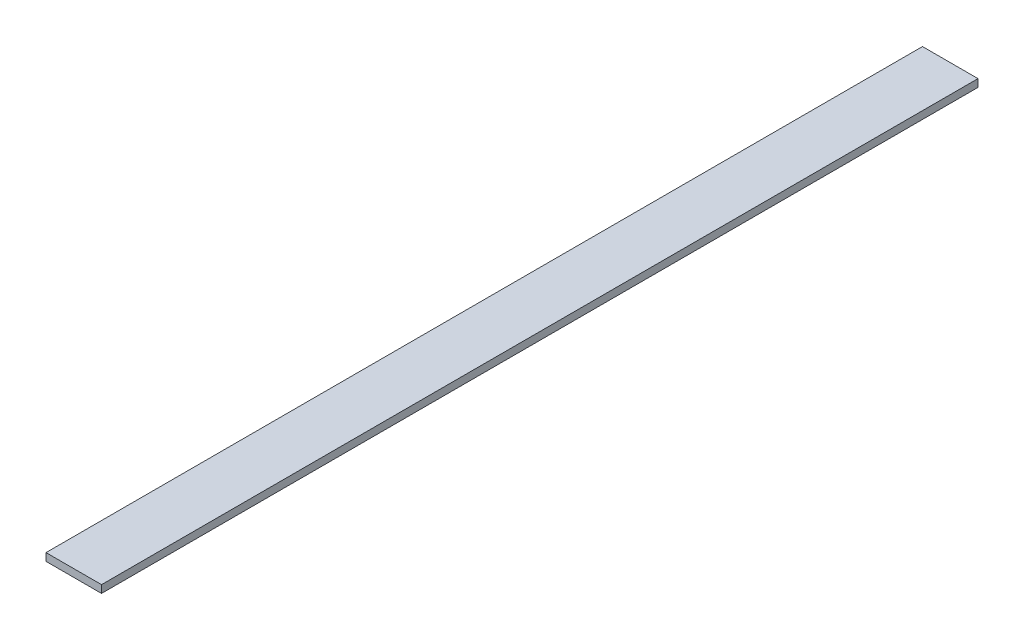
ISO-10303-21;
HEADER;
FILE_DESCRIPTION(('STEP AP214'),'2;1');
FILE_NAME('part.step','',(''),(''),'','','');
FILE_SCHEMA(('AUTOMOTIVE_DESIGN { 1 0 10303 214 1 1 1 1 }'));
ENDSEC;
DATA;
#1=APPLICATION_CONTEXT('core data for automotive mechanical design processes');
#2=APPLICATION_PROTOCOL_DEFINITION('international standard','automotive_design',2000,#1);
#3=PRODUCT_CONTEXT('',#1,'mechanical');
#4=PRODUCT('Part','Part','',(#3));
#5=PRODUCT_RELATED_PRODUCT_CATEGORY('part','',(#4));
#6=PRODUCT_DEFINITION_FORMATION('','',#4);
#7=PRODUCT_DEFINITION_CONTEXT('part definition',#1,'design');
#8=PRODUCT_DEFINITION('design','',#6,#7);
#9=PRODUCT_DEFINITION_SHAPE('','',#8);
#10=(LENGTH_UNIT() NAMED_UNIT(*) SI_UNIT(.MILLI.,.METRE.));
#11=(NAMED_UNIT(*) PLANE_ANGLE_UNIT() SI_UNIT($,.RADIAN.));
#12=(NAMED_UNIT(*) SI_UNIT($,.STERADIAN.) SOLID_ANGLE_UNIT());
#13=UNCERTAINTY_MEASURE_WITH_UNIT(LENGTH_MEASURE(1.E-05),#10,'distance_accuracy_value','');
#14=(GEOMETRIC_REPRESENTATION_CONTEXT(3) GLOBAL_UNCERTAINTY_ASSIGNED_CONTEXT((#13)) GLOBAL_UNIT_ASSIGNED_CONTEXT((#10,
#11,#12)) REPRESENTATION_CONTEXT('',''));
#15=CARTESIAN_POINT('',(0.,0.,0.));
#16=DIRECTION('',(0.,0.,1.));
#17=DIRECTION('',(1.,0.,0.));
#18=AXIS2_PLACEMENT_3D('',#15,#16,#17);
#19=CARTESIAN_POINT('',(-9.07227673497025,-34.3699379173652,21.1841612588325));
#20=DIRECTION('',(0.,-1.,0.));
#21=DIRECTION('',(0.,0.,-1.));
#22=AXIS2_PLACEMENT_3D('',#19,#20,#21);
#23=PLANE('',#22);
#24=DIRECTION('',(0.,0.,1.));
#25=VECTOR('',#24,1.);
#26=CARTESIAN_POINT('',(-8.1449767349703,-34.3699379173652,4.1330362588325));
#27=LINE('',#26,#25);
#28=CARTESIAN_POINT('',(-8.1449767349703,-34.3699379173652,6.2864612588325));
#29=VERTEX_POINT('',#28);
#30=CARTESIAN_POINT('',(-8.1449767349703,-34.3699379173652,8.5818612588325));
#31=VERTEX_POINT('',#30);
#32=EDGE_CURVE('E11',#29,#31,#27,.T.);
#33=ORIENTED_EDGE('',*,*,#32,.T.);
#34=DIRECTION('',(1.,0.,0.));
#35=VECTOR('',#34,1.);
#36=CARTESIAN_POINT('',(25.7516232650298,-34.3699379173652,8.58186125883252));
#37=LINE('',#36,#35);
#38=CARTESIAN_POINT('',(-7.99957673497019,-34.3699379173652,8.5818612588325));
#39=VERTEX_POINT('',#38);
#40=EDGE_CURVE('E99',#31,#39,#37,.T.);
#41=ORIENTED_EDGE('',*,*,#40,.T.);
#42=DIRECTION('',(0.,0.,-1.));
#43=VECTOR('',#42,1.);
#44=CARTESIAN_POINT('',(-7.99957673497019,-34.3699379173652,2.9853362588325));
#45=LINE('',#44,#43);
#46=CARTESIAN_POINT('',(-7.99957673497019,-34.3699379173652,6.2864612588325));
#47=VERTEX_POINT('',#46);
#48=EDGE_CURVE('E75',#39,#47,#45,.T.);
#49=ORIENTED_EDGE('',*,*,#48,.T.);
#50=DIRECTION('',(-1.,0.,0.));
#51=VECTOR('',#50,1.);
#52=CARTESIAN_POINT('',(25.6789232650299,-34.3699379173652,6.28646125883252));
#53=LINE('',#52,#51);
#54=EDGE_CURVE('E83',#47,#29,#53,.T.);
#55=ORIENTED_EDGE('',*,*,#54,.T.);
#56=EDGE_LOOP('',(#33,#41,#49,#55));
#57=FACE_BOUND('',#56,.T.);
#58=ADVANCED_FACE('F16',(#57),#23,.F.);
#59=CARTESIAN_POINT('',(-8.1449767349703,-34.3699379173652,8.5818612588325));
#60=DIRECTION('',(-1.,0.,0.));
#61=DIRECTION('',(0.,1.,0.));
#62=AXIS2_PLACEMENT_3D('',#59,#60,#61);
#63=PLANE('',#62);
#64=ORIENTED_EDGE('',*,*,#32,.F.);
#65=DIRECTION('',(0.,-1.,0.));
#66=VECTOR('',#65,1.);
#67=CARTESIAN_POINT('',(-8.1449767349703,-34.3699379173652,6.2864612588325));
#68=LINE('',#67,#66);
#69=CARTESIAN_POINT('',(-8.1449767349703,-34.3899379173652,6.2864612588325));
#70=VERTEX_POINT('',#69);
#71=EDGE_CURVE('E66',#29,#70,#68,.T.);
#72=ORIENTED_EDGE('',*,*,#71,.T.);
#73=DIRECTION('',(0.,0.,-1.));
#74=VECTOR('',#73,1.);
#75=CARTESIAN_POINT('',(-8.1449767349703,-34.3899379173652,6.2864612588325));
#76=LINE('',#75,#74);
#77=CARTESIAN_POINT('',(-8.1449767349703,-34.3899379173652,8.5818612588325));
#78=VERTEX_POINT('',#77);
#79=EDGE_CURVE('E69',#78,#70,#76,.T.);
#80=ORIENTED_EDGE('',*,*,#79,.F.);
#81=DIRECTION('',(0.,-1.,0.));
#82=VECTOR('',#81,1.);
#83=CARTESIAN_POINT('',(-8.1449767349703,-34.3699379173652,8.5818612588325));
#84=LINE('',#83,#82);
#85=EDGE_CURVE('E27',#31,#78,#84,.T.);
#86=ORIENTED_EDGE('',*,*,#85,.F.);
#87=EDGE_LOOP('',(#64,#72,#80,#86));
#88=FACE_BOUND('',#87,.T.);
#89=ADVANCED_FACE('F68',(#88),#63,.T.);
#90=CARTESIAN_POINT('',(-7.99957673497019,-34.3699379173652,8.5818612588325));
#91=DIRECTION('',(0.,0.,1.));
#92=DIRECTION('',(0.,-1.,0.));
#93=AXIS2_PLACEMENT_3D('',#90,#91,#92);
#94=PLANE('',#93);
#95=ORIENTED_EDGE('',*,*,#40,.F.);
#96=ORIENTED_EDGE('',*,*,#85,.T.);
#97=DIRECTION('',(-1.,0.,0.));
#98=VECTOR('',#97,1.);
#99=CARTESIAN_POINT('',(-8.1449767349703,-34.3899379173652,8.5818612588325));
#100=LINE('',#99,#98);
#101=CARTESIAN_POINT('',(-7.99957673497019,-34.3899379173652,8.5818612588325));
#102=VERTEX_POINT('',#101);
#103=EDGE_CURVE('E20',#102,#78,#100,.T.);
#104=ORIENTED_EDGE('',*,*,#103,.F.);
#105=DIRECTION('',(0.,-1.,0.));
#106=VECTOR('',#105,1.);
#107=CARTESIAN_POINT('',(-7.99957673497019,-34.3699379173652,8.5818612588325));
#108=LINE('',#107,#106);
#109=EDGE_CURVE('E98',#39,#102,#108,.T.);
#110=ORIENTED_EDGE('',*,*,#109,.F.);
#111=EDGE_LOOP('',(#95,#96,#104,#110));
#112=FACE_BOUND('',#111,.T.);
#113=ADVANCED_FACE('F113',(#112),#94,.T.);
#114=CARTESIAN_POINT('',(-7.99957673497019,-34.3699379173652,6.2864612588325));
#115=DIRECTION('',(1.,0.,0.));
#116=DIRECTION('',(0.,0.,-1.));
#117=AXIS2_PLACEMENT_3D('',#114,#115,#116);
#118=PLANE('',#117);
#119=ORIENTED_EDGE('',*,*,#48,.F.);
#120=ORIENTED_EDGE('',*,*,#109,.T.);
#121=DIRECTION('',(0.,0.,1.));
#122=VECTOR('',#121,1.);
#123=CARTESIAN_POINT('',(-7.99957673497019,-34.3899379173652,8.5818612588325));
#124=LINE('',#123,#122);
#125=CARTESIAN_POINT('',(-7.99957673497019,-34.3899379173652,6.2864612588325));
#126=VERTEX_POINT('',#125);
#127=EDGE_CURVE('E89',#126,#102,#124,.T.);
#128=ORIENTED_EDGE('',*,*,#127,.F.);
#129=DIRECTION('',(0.,-1.,0.));
#130=VECTOR('',#129,1.);
#131=CARTESIAN_POINT('',(-7.99957673497019,-34.3699379173652,6.2864612588325));
#132=LINE('',#131,#130);
#133=EDGE_CURVE('E76',#47,#126,#132,.T.);
#134=ORIENTED_EDGE('',*,*,#133,.F.);
#135=EDGE_LOOP('',(#119,#120,#128,#134));
#136=FACE_BOUND('',#135,.T.);
#137=ADVANCED_FACE('F115',(#136),#118,.T.);
#138=CARTESIAN_POINT('',(-8.1449767349703,-34.3699379173652,6.2864612588325));
#139=DIRECTION('',(0.,0.,-1.));
#140=DIRECTION('',(-1.,0.,0.));
#141=AXIS2_PLACEMENT_3D('',#138,#139,#140);
#142=PLANE('',#141);
#143=ORIENTED_EDGE('',*,*,#54,.F.);
#144=ORIENTED_EDGE('',*,*,#133,.T.);
#145=DIRECTION('',(1.,0.,0.));
#146=VECTOR('',#145,1.);
#147=CARTESIAN_POINT('',(-7.99957673497019,-34.3899379173652,6.2864612588325));
#148=LINE('',#147,#146);
#149=EDGE_CURVE('E80',#70,#126,#148,.T.);
#150=ORIENTED_EDGE('',*,*,#149,.F.);
#151=ORIENTED_EDGE('',*,*,#71,.F.);
#152=EDGE_LOOP('',(#143,#144,#150,#151));
#153=FACE_BOUND('',#152,.T.);
#154=ADVANCED_FACE('F85',(#153),#142,.T.);
#155=CARTESIAN_POINT('',(-8.07227673497025,-34.3899379173652,7.4341612588325));
#156=DIRECTION('',(0.,-1.,0.));
#157=DIRECTION('',(0.,0.,-1.));
#158=AXIS2_PLACEMENT_3D('',#155,#156,#157);
#159=PLANE('',#158);
#160=ORIENTED_EDGE('',*,*,#149,.T.);
#161=ORIENTED_EDGE('',*,*,#127,.T.);
#162=ORIENTED_EDGE('',*,*,#103,.T.);
#163=ORIENTED_EDGE('',*,*,#79,.T.);
#164=EDGE_LOOP('',(#160,#161,#162,#163));
#165=FACE_BOUND('',#164,.T.);
#166=ADVANCED_FACE('F18',(#165),#159,.T.);
#167=CLOSED_SHELL('',(#58,#89,#113,#137,#154,#166));
#168=MANIFOLD_SOLID_BREP('B1',#167);
#169=ADVANCED_BREP_SHAPE_REPRESENTATION('',(#18,#168),#14);
#170=SHAPE_DEFINITION_REPRESENTATION(#9,#169);
ENDSEC;
END-ISO-10303-21;
